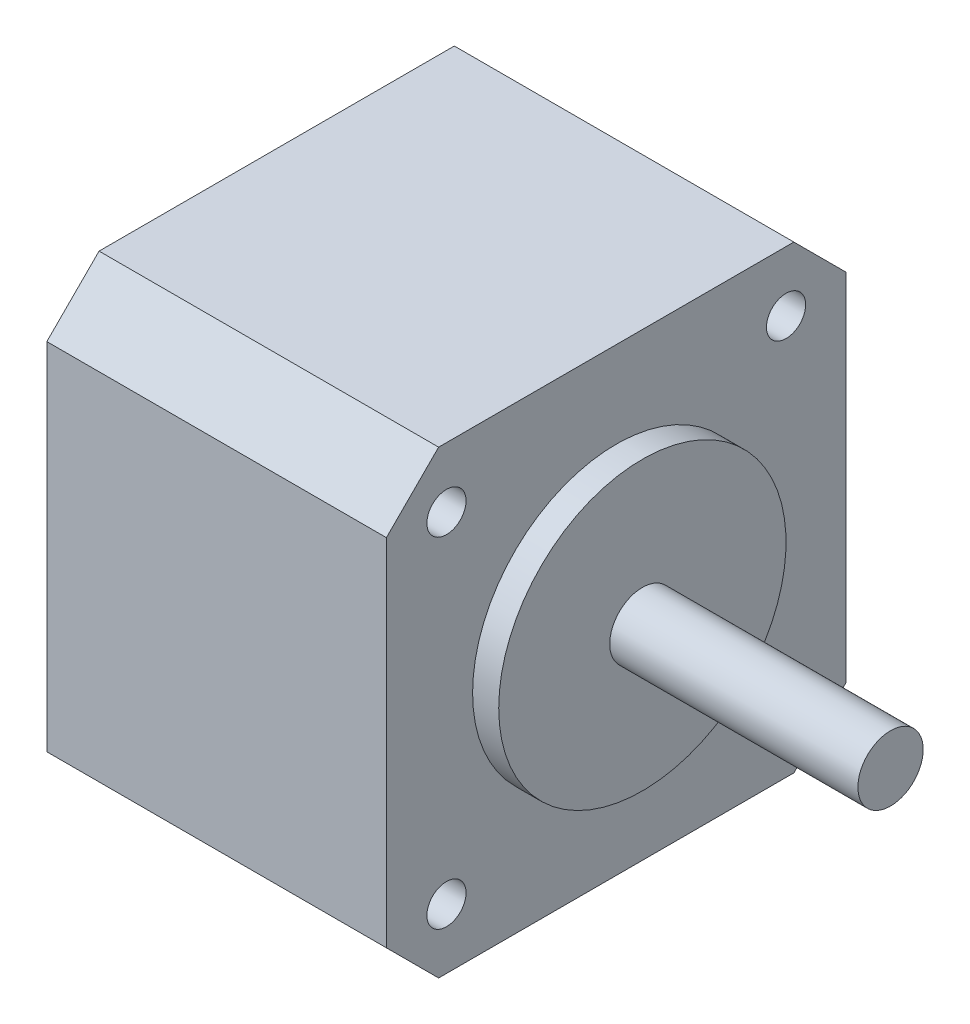
ISO-10303-21;
HEADER;
FILE_DESCRIPTION(('STEP AP214'),'2;1');
FILE_NAME('part.step','',(''),(''),'','','');
FILE_SCHEMA(('AUTOMOTIVE_DESIGN { 1 0 10303 214 1 1 1 1 }'));
ENDSEC;
DATA;
#1=APPLICATION_CONTEXT('core data for automotive mechanical design processes');
#2=APPLICATION_PROTOCOL_DEFINITION('international standard','automotive_design',2000,#1);
#3=PRODUCT_CONTEXT('',#1,'mechanical');
#4=PRODUCT('Part','Part','',(#3));
#5=PRODUCT_RELATED_PRODUCT_CATEGORY('part','',(#4));
#6=PRODUCT_DEFINITION_FORMATION('','',#4);
#7=PRODUCT_DEFINITION_CONTEXT('part definition',#1,'design');
#8=PRODUCT_DEFINITION('design','',#6,#7);
#9=PRODUCT_DEFINITION_SHAPE('','',#8);
#10=(LENGTH_UNIT() NAMED_UNIT(*) SI_UNIT(.MILLI.,.METRE.));
#11=(NAMED_UNIT(*) PLANE_ANGLE_UNIT() SI_UNIT($,.RADIAN.));
#12=(NAMED_UNIT(*) SI_UNIT($,.STERADIAN.) SOLID_ANGLE_UNIT());
#13=UNCERTAINTY_MEASURE_WITH_UNIT(LENGTH_MEASURE(1.E-05),#10,'distance_accuracy_value','');
#14=(GEOMETRIC_REPRESENTATION_CONTEXT(3) GLOBAL_UNCERTAINTY_ASSIGNED_CONTEXT((#13)) GLOBAL_UNIT_ASSIGNED_CONTEXT((#10,
#11,#12)) REPRESENTATION_CONTEXT('',''));
#15=CARTESIAN_POINT('',(0.,0.,0.));
#16=DIRECTION('',(0.,0.,1.));
#17=DIRECTION('',(1.,0.,0.));
#18=AXIS2_PLACEMENT_3D('',#15,#16,#17);
#19=CARTESIAN_POINT('',(-19.,0.,0.));
#20=DIRECTION('',(1.,0.,0.));
#21=DIRECTION('',(0.,0.,-1.));
#22=AXIS2_PLACEMENT_3D('',#19,#20,#21);
#23=CYLINDRICAL_SURFACE('',#22,2.5);
#24=CARTESIAN_POINT('',(-19.,0.,0.));
#25=DIRECTION('',(1.,0.,0.));
#26=DIRECTION('',(0.,0.,-1.));
#27=AXIS2_PLACEMENT_3D('',#24,#25,#26);
#28=CIRCLE('',#27,2.5);
#29=CARTESIAN_POINT('',(-19.,0.,-2.5));
#30=VERTEX_POINT('',#29);
#31=EDGE_CURVE('E146',#30,#30,#28,.T.);
#32=ORIENTED_EDGE('',*,*,#31,.T.);
#33=EDGE_LOOP('',(#32));
#34=FACE_BOUND('',#33,.T.);
#35=CARTESIAN_POINT('',(0.,0.,0.));
#36=DIRECTION('',(1.,0.,0.));
#37=DIRECTION('',(0.,0.,-1.));
#38=AXIS2_PLACEMENT_3D('',#35,#36,#37);
#39=CIRCLE('',#38,2.5);
#40=CARTESIAN_POINT('',(0.,0.,-2.5));
#41=VERTEX_POINT('',#40);
#42=EDGE_CURVE('E150',#41,#41,#39,.T.);
#43=ORIENTED_EDGE('',*,*,#42,.F.);
#44=EDGE_LOOP('',(#43));
#45=FACE_BOUND('',#44,.T.);
#46=ADVANCED_FACE('F42',(#34,#45),#23,.T.);
#47=CARTESIAN_POINT('',(0.,0.,0.));
#48=DIRECTION('',(1.,0.,0.));
#49=DIRECTION('',(0.,0.,-1.));
#50=AXIS2_PLACEMENT_3D('',#47,#48,#49);
#51=PLANE('',#50);
#52=ORIENTED_EDGE('',*,*,#42,.T.);
#53=EDGE_LOOP('',(#52));
#54=FACE_BOUND('',#53,.T.);
#55=ADVANCED_FACE('F230',(#54),#51,.T.);
#56=CARTESIAN_POINT('',(-21.,0.,0.));
#57=DIRECTION('',(1.,0.,0.));
#58=DIRECTION('',(0.,0.,-1.));
#59=AXIS2_PLACEMENT_3D('',#56,#57,#58);
#60=CYLINDRICAL_SURFACE('',#59,11.);
#61=CARTESIAN_POINT('',(-21.,0.,0.));
#62=DIRECTION('',(-1.,0.,0.));
#63=DIRECTION('',(0.,0.,1.));
#64=AXIS2_PLACEMENT_3D('',#61,#62,#63);
#65=CIRCLE('',#64,11.);
#66=CARTESIAN_POINT('',(-21.,0.,11.));
#67=VERTEX_POINT('',#66);
#68=EDGE_CURVE('E139',#67,#67,#65,.T.);
#69=ORIENTED_EDGE('',*,*,#68,.F.);
#70=EDGE_LOOP('',(#69));
#71=FACE_BOUND('',#70,.T.);
#72=CARTESIAN_POINT('',(-19.,0.,0.));
#73=DIRECTION('',(-1.,0.,0.));
#74=DIRECTION('',(0.,0.,1.));
#75=AXIS2_PLACEMENT_3D('',#72,#73,#74);
#76=CIRCLE('',#75,11.);
#77=CARTESIAN_POINT('',(-19.,0.,11.));
#78=VERTEX_POINT('',#77);
#79=EDGE_CURVE('E135',#78,#78,#76,.T.);
#80=ORIENTED_EDGE('',*,*,#79,.T.);
#81=EDGE_LOOP('',(#80));
#82=FACE_BOUND('',#81,.T.);
#83=ADVANCED_FACE('F236',(#71,#82),#60,.T.);
#84=CARTESIAN_POINT('',(-19.,0.,0.));
#85=DIRECTION('',(-1.,0.,0.));
#86=DIRECTION('',(0.,0.,1.));
#87=AXIS2_PLACEMENT_3D('',#84,#85,#86);
#88=PLANE('',#87);
#89=ORIENTED_EDGE('',*,*,#31,.F.);
#90=EDGE_LOOP('',(#89));
#91=FACE_BOUND('',#90,.T.);
#92=ORIENTED_EDGE('',*,*,#79,.F.);
#93=EDGE_LOOP('',(#92));
#94=FACE_BOUND('',#93,.T.);
#95=ADVANCED_FACE('F285',(#91,#94),#88,.F.);
#96=CARTESIAN_POINT('',(-21.,0.,0.));
#97=DIRECTION('',(1.,0.,0.));
#98=DIRECTION('',(0.,0.,-1.));
#99=AXIS2_PLACEMENT_3D('',#96,#97,#98);
#100=PLANE('',#99);
#101=ORIENTED_EDGE('',*,*,#68,.T.);
#102=EDGE_LOOP('',(#101));
#103=FACE_BOUND('',#102,.T.);
#104=CARTESIAN_POINT('',(-21.,-13.,13.));
#105=DIRECTION('',(-1.,0.,0.));
#106=DIRECTION('',(0.,0.,1.));
#107=AXIS2_PLACEMENT_3D('',#104,#105,#106);
#108=CIRCLE('',#107,1.5);
#109=CARTESIAN_POINT('',(-21.,-13.,14.5));
#110=VERTEX_POINT('',#109);
#111=EDGE_CURVE('E193',#110,#110,#108,.T.);
#112=ORIENTED_EDGE('',*,*,#111,.T.);
#113=EDGE_LOOP('',(#112));
#114=FACE_BOUND('',#113,.T.);
#115=CARTESIAN_POINT('',(-21.,13.,-13.));
#116=DIRECTION('',(-1.,0.,0.));
#117=DIRECTION('',(0.,0.,1.));
#118=AXIS2_PLACEMENT_3D('',#115,#116,#117);
#119=CIRCLE('',#118,1.5);
#120=CARTESIAN_POINT('',(-21.,13.,-11.5));
#121=VERTEX_POINT('',#120);
#122=EDGE_CURVE('E180',#121,#121,#119,.T.);
#123=ORIENTED_EDGE('',*,*,#122,.T.);
#124=EDGE_LOOP('',(#123));
#125=FACE_BOUND('',#124,.T.);
#126=DIRECTION('',(0.,0.,1.));
#127=VECTOR('',#126,1.);
#128=CARTESIAN_POINT('',(-21.,-17.6,-17.6));
#129=LINE('',#128,#127);
#130=CARTESIAN_POINT('',(-21.,-17.6,-13.6));
#131=VERTEX_POINT('',#130);
#132=CARTESIAN_POINT('',(-21.,-17.6,13.6));
#133=VERTEX_POINT('',#132);
#134=EDGE_CURVE('E125',#131,#133,#129,.T.);
#135=ORIENTED_EDGE('',*,*,#134,.F.);
#136=DIRECTION('',(0.,-0.707106781186549,0.707106781186546));
#137=VECTOR('',#136,1.);
#138=CARTESIAN_POINT('',(-21.,-15.6,-15.6));
#139=LINE('',#138,#137);
#140=CARTESIAN_POINT('',(-21.,-13.6,-17.6));
#141=VERTEX_POINT('',#140);
#142=EDGE_CURVE('E108',#131,#141,#139,.F.);
#143=ORIENTED_EDGE('',*,*,#142,.T.);
#144=DIRECTION('',(0.,-1.,0.));
#145=VECTOR('',#144,1.);
#146=CARTESIAN_POINT('',(-21.,-17.6,-17.6));
#147=LINE('',#146,#145);
#148=CARTESIAN_POINT('',(-21.,13.6,-17.6));
#149=VERTEX_POINT('',#148);
#150=EDGE_CURVE('E136',#149,#141,#147,.T.);
#151=ORIENTED_EDGE('',*,*,#150,.F.);
#152=DIRECTION('',(0.,-0.707106781186546,-0.707106781186549));
#153=VECTOR('',#152,1.);
#154=CARTESIAN_POINT('',(-21.,15.6,-15.6));
#155=LINE('',#154,#153);
#156=CARTESIAN_POINT('',(-21.,17.6,-13.6));
#157=VERTEX_POINT('',#156);
#158=EDGE_CURVE('E155',#149,#157,#155,.F.);
#159=ORIENTED_EDGE('',*,*,#158,.T.);
#160=DIRECTION('',(0.,0.,-1.));
#161=VECTOR('',#160,1.);
#162=CARTESIAN_POINT('',(-21.,17.6,-17.6));
#163=LINE('',#162,#161);
#164=CARTESIAN_POINT('',(-21.,17.6,13.6));
#165=VERTEX_POINT('',#164);
#166=EDGE_CURVE('E141',#165,#157,#163,.T.);
#167=ORIENTED_EDGE('',*,*,#166,.F.);
#168=DIRECTION('',(0.,0.707106781186549,-0.707106781186546));
#169=VECTOR('',#168,1.);
#170=CARTESIAN_POINT('',(-21.,15.6,15.6));
#171=LINE('',#170,#169);
#172=CARTESIAN_POINT('',(-21.,13.6,17.6));
#173=VERTEX_POINT('',#172);
#174=EDGE_CURVE('E129',#165,#173,#171,.F.);
#175=ORIENTED_EDGE('',*,*,#174,.T.);
#176=DIRECTION('',(0.,1.,0.));
#177=VECTOR('',#176,1.);
#178=CARTESIAN_POINT('',(-21.,-17.6,17.6));
#179=LINE('',#178,#177);
#180=CARTESIAN_POINT('',(-21.,-13.6,17.6));
#181=VERTEX_POINT('',#180);
#182=EDGE_CURVE('E179',#181,#173,#179,.T.);
#183=ORIENTED_EDGE('',*,*,#182,.F.);
#184=DIRECTION('',(0.,0.707106781186546,0.707106781186549));
#185=VECTOR('',#184,1.);
#186=CARTESIAN_POINT('',(-21.,-15.6,15.6));
#187=LINE('',#186,#185);
#188=EDGE_CURVE('E119',#181,#133,#187,.F.);
#189=ORIENTED_EDGE('',*,*,#188,.T.);
#190=EDGE_LOOP('',(#135,#143,#151,#159,#167,#175,#183,#189));
#191=FACE_BOUND('',#190,.T.);
#192=CARTESIAN_POINT('',(-21.,13.,13.));
#193=DIRECTION('',(-1.,0.,0.));
#194=DIRECTION('',(0.,0.,1.));
#195=AXIS2_PLACEMENT_3D('',#192,#193,#194);
#196=CIRCLE('',#195,1.5);
#197=CARTESIAN_POINT('',(-21.,13.,14.5));
#198=VERTEX_POINT('',#197);
#199=EDGE_CURVE('E185',#198,#198,#196,.T.);
#200=ORIENTED_EDGE('',*,*,#199,.T.);
#201=EDGE_LOOP('',(#200));
#202=FACE_BOUND('',#201,.T.);
#203=CARTESIAN_POINT('',(-21.,-13.,-13.));
#204=DIRECTION('',(-1.,0.,0.));
#205=DIRECTION('',(0.,0.,1.));
#206=AXIS2_PLACEMENT_3D('',#203,#204,#205);
#207=CIRCLE('',#206,1.5);
#208=CARTESIAN_POINT('',(-21.,-13.,-11.5));
#209=VERTEX_POINT('',#208);
#210=EDGE_CURVE('E189',#209,#209,#207,.T.);
#211=ORIENTED_EDGE('',*,*,#210,.T.);
#212=EDGE_LOOP('',(#211));
#213=FACE_BOUND('',#212,.T.);
#214=ADVANCED_FACE('F132',(#103,#114,#125,#191,#202,#213),#100,.T.);
#215=CARTESIAN_POINT('',(-25.,-17.6,17.6));
#216=DIRECTION('',(0.,0.,-1.));
#217=DIRECTION('',(-1.,0.,0.));
#218=AXIS2_PLACEMENT_3D('',#215,#216,#217);
#219=PLANE('',#218);
#220=DIRECTION('',(0.,1.,0.));
#221=VECTOR('',#220,1.);
#222=CARTESIAN_POINT('',(-47.,-17.6,17.6));
#223=LINE('',#222,#221);
#224=CARTESIAN_POINT('',(-47.,-13.6,17.6));
#225=VERTEX_POINT('',#224);
#226=CARTESIAN_POINT('',(-47.,13.6,17.6));
#227=VERTEX_POINT('',#226);
#228=EDGE_CURVE('E207',#225,#227,#223,.T.);
#229=ORIENTED_EDGE('',*,*,#228,.F.);
#230=DIRECTION('',(1.,0.,0.));
#231=VECTOR('',#230,1.);
#232=CARTESIAN_POINT('',(-25.,-13.6,17.6));
#233=LINE('',#232,#231);
#234=EDGE_CURVE('E170',#225,#181,#233,.T.);
#235=ORIENTED_EDGE('',*,*,#234,.T.);
#236=ORIENTED_EDGE('',*,*,#182,.T.);
#237=DIRECTION('',(-1.,0.,0.));
#238=VECTOR('',#237,1.);
#239=CARTESIAN_POINT('',(-25.,13.6,17.6));
#240=LINE('',#239,#238);
#241=EDGE_CURVE('E168',#173,#227,#240,.T.);
#242=ORIENTED_EDGE('',*,*,#241,.T.);
#243=EDGE_LOOP('',(#229,#235,#236,#242));
#244=FACE_BOUND('',#243,.T.);
#245=ADVANCED_FACE('F284',(#244),#219,.F.);
#246=CARTESIAN_POINT('',(-25.,17.6,-17.6));
#247=DIRECTION('',(0.,-1.,0.));
#248=DIRECTION('',(0.,0.,-1.));
#249=AXIS2_PLACEMENT_3D('',#246,#247,#248);
#250=PLANE('',#249);
#251=ORIENTED_EDGE('',*,*,#166,.T.);
#252=DIRECTION('',(-1.,0.,0.));
#253=VECTOR('',#252,1.);
#254=CARTESIAN_POINT('',(-25.,17.6,-13.6));
#255=LINE('',#254,#253);
#256=CARTESIAN_POINT('',(-47.,17.6,-13.6));
#257=VERTEX_POINT('',#256);
#258=EDGE_CURVE('E11',#157,#257,#255,.T.);
#259=ORIENTED_EDGE('',*,*,#258,.T.);
#260=DIRECTION('',(0.,0.,-1.));
#261=VECTOR('',#260,1.);
#262=CARTESIAN_POINT('',(-47.,17.6,17.6));
#263=LINE('',#262,#261);
#264=CARTESIAN_POINT('',(-47.,17.6,13.6));
#265=VERTEX_POINT('',#264);
#266=EDGE_CURVE('E176',#265,#257,#263,.T.);
#267=ORIENTED_EDGE('',*,*,#266,.F.);
#268=DIRECTION('',(1.,0.,0.));
#269=VECTOR('',#268,1.);
#270=CARTESIAN_POINT('',(-25.,17.6,13.6));
#271=LINE('',#270,#269);
#272=EDGE_CURVE('E51',#265,#165,#271,.T.);
#273=ORIENTED_EDGE('',*,*,#272,.T.);
#274=EDGE_LOOP('',(#251,#259,#267,#273));
#275=FACE_BOUND('',#274,.T.);
#276=ADVANCED_FACE('F175',(#275),#250,.F.);
#277=CARTESIAN_POINT('',(-25.,-17.6,-17.6));
#278=DIRECTION('',(0.,0.,1.));
#279=DIRECTION('',(1.,0.,0.));
#280=AXIS2_PLACEMENT_3D('',#277,#278,#279);
#281=PLANE('',#280);
#282=ORIENTED_EDGE('',*,*,#150,.T.);
#283=DIRECTION('',(-1.,0.,0.));
#284=VECTOR('',#283,1.);
#285=CARTESIAN_POINT('',(-25.,-13.6,-17.6));
#286=LINE('',#285,#284);
#287=CARTESIAN_POINT('',(-47.,-13.6,-17.6));
#288=VERTEX_POINT('',#287);
#289=EDGE_CURVE('E113',#141,#288,#286,.T.);
#290=ORIENTED_EDGE('',*,*,#289,.T.);
#291=DIRECTION('',(0.,-1.,0.));
#292=VECTOR('',#291,1.);
#293=CARTESIAN_POINT('',(-47.,17.6,-17.6));
#294=LINE('',#293,#292);
#295=CARTESIAN_POINT('',(-47.,13.6,-17.6));
#296=VERTEX_POINT('',#295);
#297=EDGE_CURVE('E210',#296,#288,#294,.T.);
#298=ORIENTED_EDGE('',*,*,#297,.F.);
#299=DIRECTION('',(1.,0.,0.));
#300=VECTOR('',#299,1.);
#301=CARTESIAN_POINT('',(-25.,13.6,-17.6));
#302=LINE('',#301,#300);
#303=EDGE_CURVE('E118',#296,#149,#302,.T.);
#304=ORIENTED_EDGE('',*,*,#303,.T.);
#305=EDGE_LOOP('',(#282,#290,#298,#304));
#306=FACE_BOUND('',#305,.T.);
#307=ADVANCED_FACE('F217',(#306),#281,.F.);
#308=CARTESIAN_POINT('',(-25.,-17.6,-17.6));
#309=DIRECTION('',(0.,1.,0.));
#310=DIRECTION('',(0.,0.,1.));
#311=AXIS2_PLACEMENT_3D('',#308,#309,#310);
#312=PLANE('',#311);
#313=DIRECTION('',(0.,0.,1.));
#314=VECTOR('',#313,1.);
#315=CARTESIAN_POINT('',(-47.,-17.6,-17.6));
#316=LINE('',#315,#314);
#317=CARTESIAN_POINT('',(-47.,-17.6,-13.6));
#318=VERTEX_POINT('',#317);
#319=CARTESIAN_POINT('',(-47.,-17.6,13.6));
#320=VERTEX_POINT('',#319);
#321=EDGE_CURVE('E128',#318,#320,#316,.T.);
#322=ORIENTED_EDGE('',*,*,#321,.F.);
#323=DIRECTION('',(1.,0.,0.));
#324=VECTOR('',#323,1.);
#325=CARTESIAN_POINT('',(-25.,-17.6,-13.6));
#326=LINE('',#325,#324);
#327=EDGE_CURVE('E112',#318,#131,#326,.T.);
#328=ORIENTED_EDGE('',*,*,#327,.T.);
#329=ORIENTED_EDGE('',*,*,#134,.T.);
#330=DIRECTION('',(-1.,0.,0.));
#331=VECTOR('',#330,1.);
#332=CARTESIAN_POINT('',(-25.,-17.6,13.6));
#333=LINE('',#332,#331);
#334=EDGE_CURVE('E130',#133,#320,#333,.T.);
#335=ORIENTED_EDGE('',*,*,#334,.T.);
#336=EDGE_LOOP('',(#322,#328,#329,#335));
#337=FACE_BOUND('',#336,.T.);
#338=ADVANCED_FACE('F124',(#337),#312,.F.);
#339=CARTESIAN_POINT('',(-25.,13.,-13.));
#340=DIRECTION('',(1.,0.,0.));
#341=DIRECTION('',(0.,0.,-1.));
#342=AXIS2_PLACEMENT_3D('',#339,#340,#341);
#343=CYLINDRICAL_SURFACE('',#342,1.5);
#344=CARTESIAN_POINT('',(-25.,13.,-13.));
#345=DIRECTION('',(-1.,0.,0.));
#346=DIRECTION('',(0.,0.,1.));
#347=AXIS2_PLACEMENT_3D('',#344,#345,#346);
#348=CIRCLE('',#347,1.5);
#349=CARTESIAN_POINT('',(-25.,13.,-11.5));
#350=VERTEX_POINT('',#349);
#351=EDGE_CURVE('E186',#350,#350,#348,.T.);
#352=ORIENTED_EDGE('',*,*,#351,.T.);
#353=EDGE_LOOP('',(#352));
#354=FACE_BOUND('',#353,.T.);
#355=ORIENTED_EDGE('',*,*,#122,.F.);
#356=EDGE_LOOP('',(#355));
#357=FACE_BOUND('',#356,.T.);
#358=ADVANCED_FACE('F277',(#354,#357),#343,.F.);
#359=CARTESIAN_POINT('',(-25.,13.,13.));
#360=DIRECTION('',(1.,0.,0.));
#361=DIRECTION('',(0.,0.,-1.));
#362=AXIS2_PLACEMENT_3D('',#359,#360,#361);
#363=CYLINDRICAL_SURFACE('',#362,1.5);
#364=CARTESIAN_POINT('',(-25.,13.,13.));
#365=DIRECTION('',(-1.,0.,0.));
#366=DIRECTION('',(0.,0.,1.));
#367=AXIS2_PLACEMENT_3D('',#364,#365,#366);
#368=CIRCLE('',#367,1.5);
#369=CARTESIAN_POINT('',(-25.,13.,14.5));
#370=VERTEX_POINT('',#369);
#371=EDGE_CURVE('E190',#370,#370,#368,.T.);
#372=ORIENTED_EDGE('',*,*,#371,.T.);
#373=EDGE_LOOP('',(#372));
#374=FACE_BOUND('',#373,.T.);
#375=ORIENTED_EDGE('',*,*,#199,.F.);
#376=EDGE_LOOP('',(#375));
#377=FACE_BOUND('',#376,.T.);
#378=ADVANCED_FACE('F273',(#374,#377),#363,.F.);
#379=CARTESIAN_POINT('',(-25.,-13.,13.));
#380=DIRECTION('',(1.,0.,0.));
#381=DIRECTION('',(0.,0.,-1.));
#382=AXIS2_PLACEMENT_3D('',#379,#380,#381);
#383=CYLINDRICAL_SURFACE('',#382,1.5);
#384=CARTESIAN_POINT('',(-25.,-13.,13.));
#385=DIRECTION('',(-1.,0.,0.));
#386=DIRECTION('',(0.,0.,1.));
#387=AXIS2_PLACEMENT_3D('',#384,#385,#386);
#388=CIRCLE('',#387,1.5);
#389=CARTESIAN_POINT('',(-25.,-13.,14.5));
#390=VERTEX_POINT('',#389);
#391=EDGE_CURVE('E196',#390,#390,#388,.T.);
#392=ORIENTED_EDGE('',*,*,#391,.T.);
#393=EDGE_LOOP('',(#392));
#394=FACE_BOUND('',#393,.T.);
#395=ORIENTED_EDGE('',*,*,#111,.F.);
#396=EDGE_LOOP('',(#395));
#397=FACE_BOUND('',#396,.T.);
#398=ADVANCED_FACE('F269',(#394,#397),#383,.F.);
#399=CARTESIAN_POINT('',(-25.,-13.,-13.));
#400=DIRECTION('',(1.,0.,0.));
#401=DIRECTION('',(0.,0.,-1.));
#402=AXIS2_PLACEMENT_3D('',#399,#400,#401);
#403=CYLINDRICAL_SURFACE('',#402,1.5);
#404=CARTESIAN_POINT('',(-25.,-13.,-13.));
#405=DIRECTION('',(-1.,0.,0.));
#406=DIRECTION('',(0.,0.,1.));
#407=AXIS2_PLACEMENT_3D('',#404,#405,#406);
#408=CIRCLE('',#407,1.5);
#409=CARTESIAN_POINT('',(-25.,-13.,-11.5));
#410=VERTEX_POINT('',#409);
#411=EDGE_CURVE('E201',#410,#410,#408,.T.);
#412=ORIENTED_EDGE('',*,*,#411,.T.);
#413=EDGE_LOOP('',(#412));
#414=FACE_BOUND('',#413,.T.);
#415=ORIENTED_EDGE('',*,*,#210,.F.);
#416=EDGE_LOOP('',(#415));
#417=FACE_BOUND('',#416,.T.);
#418=ADVANCED_FACE('F266',(#414,#417),#403,.F.);
#419=CARTESIAN_POINT('',(-25.,0.,0.));
#420=DIRECTION('',(-1.,0.,0.));
#421=DIRECTION('',(0.,0.,1.));
#422=AXIS2_PLACEMENT_3D('',#419,#420,#421);
#423=PLANE('',#422);
#424=ORIENTED_EDGE('',*,*,#411,.F.);
#425=EDGE_LOOP('',(#424));
#426=FACE_BOUND('',#425,.T.);
#427=ADVANCED_FACE('F264',(#426),#423,.F.);
#428=ORIENTED_EDGE('',*,*,#391,.F.);
#429=EDGE_LOOP('',(#428));
#430=FACE_BOUND('',#429,.T.);
#431=ADVANCED_FACE('F361',(#430),#423,.F.);
#432=ORIENTED_EDGE('',*,*,#371,.F.);
#433=EDGE_LOOP('',(#432));
#434=FACE_BOUND('',#433,.T.);
#435=ADVANCED_FACE('F261',(#434),#423,.F.);
#436=ORIENTED_EDGE('',*,*,#351,.F.);
#437=EDGE_LOOP('',(#436));
#438=FACE_BOUND('',#437,.T.);
#439=ADVANCED_FACE('F256',(#438),#423,.F.);
#440=CARTESIAN_POINT('',(-47.,0.,0.));
#441=DIRECTION('',(-1.,0.,0.));
#442=DIRECTION('',(0.,0.,1.));
#443=AXIS2_PLACEMENT_3D('',#440,#441,#442);
#444=PLANE('',#443);
#445=ORIENTED_EDGE('',*,*,#297,.T.);
#446=DIRECTION('',(0.,0.707106781186549,-0.707106781186546));
#447=VECTOR('',#446,1.);
#448=CARTESIAN_POINT('',(-47.,-15.6,-15.6));
#449=LINE('',#448,#447);
#450=EDGE_CURVE('E166',#288,#318,#449,.F.);
#451=ORIENTED_EDGE('',*,*,#450,.T.);
#452=ORIENTED_EDGE('',*,*,#321,.T.);
#453=DIRECTION('',(0.,-0.707106781186546,-0.707106781186549));
#454=VECTOR('',#453,1.);
#455=CARTESIAN_POINT('',(-47.,-15.6,15.6));
#456=LINE('',#455,#454);
#457=EDGE_CURVE('E164',#320,#225,#456,.F.);
#458=ORIENTED_EDGE('',*,*,#457,.T.);
#459=ORIENTED_EDGE('',*,*,#228,.T.);
#460=DIRECTION('',(0.,-0.707106781186549,0.707106781186546));
#461=VECTOR('',#460,1.);
#462=CARTESIAN_POINT('',(-47.,15.6,15.6));
#463=LINE('',#462,#461);
#464=EDGE_CURVE('E63',#227,#265,#463,.F.);
#465=ORIENTED_EDGE('',*,*,#464,.T.);
#466=ORIENTED_EDGE('',*,*,#266,.T.);
#467=DIRECTION('',(0.,0.707106781186546,0.707106781186549));
#468=VECTOR('',#467,1.);
#469=CARTESIAN_POINT('',(-47.,15.6,-15.6));
#470=LINE('',#469,#468);
#471=EDGE_CURVE('E162',#257,#296,#470,.F.);
#472=ORIENTED_EDGE('',*,*,#471,.T.);
#473=EDGE_LOOP('',(#445,#451,#452,#458,#459,#465,#466,#472));
#474=FACE_BOUND('',#473,.T.);
#475=ADVANCED_FACE('F213',(#474),#444,.T.);
#476=CARTESIAN_POINT('',(-25.,-17.6,-13.6));
#477=DIRECTION('',(0.,0.707106781186546,0.707106781186549));
#478=DIRECTION('',(1.,0.,0.));
#479=AXIS2_PLACEMENT_3D('',#476,#477,#478);
#480=PLANE('',#479);
#481=ORIENTED_EDGE('',*,*,#450,.F.);
#482=ORIENTED_EDGE('',*,*,#289,.F.);
#483=ORIENTED_EDGE('',*,*,#142,.F.);
#484=ORIENTED_EDGE('',*,*,#327,.F.);
#485=EDGE_LOOP('',(#481,#482,#483,#484));
#486=FACE_BOUND('',#485,.T.);
#487=ADVANCED_FACE('F111',(#486),#480,.F.);
#488=CARTESIAN_POINT('',(-25.,-13.6,17.6));
#489=DIRECTION('',(0.,0.707106781186549,-0.707106781186546));
#490=DIRECTION('',(1.,0.,0.));
#491=AXIS2_PLACEMENT_3D('',#488,#489,#490);
#492=PLANE('',#491);
#493=ORIENTED_EDGE('',*,*,#457,.F.);
#494=ORIENTED_EDGE('',*,*,#334,.F.);
#495=ORIENTED_EDGE('',*,*,#188,.F.);
#496=ORIENTED_EDGE('',*,*,#234,.F.);
#497=EDGE_LOOP('',(#493,#494,#495,#496));
#498=FACE_BOUND('',#497,.T.);
#499=ADVANCED_FACE('F221',(#498),#492,.F.);
#500=CARTESIAN_POINT('',(-25.,13.6,-17.6));
#501=DIRECTION('',(0.,-0.707106781186549,0.707106781186546));
#502=DIRECTION('',(1.,0.,0.));
#503=AXIS2_PLACEMENT_3D('',#500,#501,#502);
#504=PLANE('',#503);
#505=ORIENTED_EDGE('',*,*,#471,.F.);
#506=ORIENTED_EDGE('',*,*,#258,.F.);
#507=ORIENTED_EDGE('',*,*,#158,.F.);
#508=ORIENTED_EDGE('',*,*,#303,.F.);
#509=EDGE_LOOP('',(#505,#506,#507,#508));
#510=FACE_BOUND('',#509,.T.);
#511=ADVANCED_FACE('F219',(#510),#504,.F.);
#512=CARTESIAN_POINT('',(-25.,17.6,13.6));
#513=DIRECTION('',(0.,-0.707106781186546,-0.707106781186549));
#514=DIRECTION('',(1.,0.,0.));
#515=AXIS2_PLACEMENT_3D('',#512,#513,#514);
#516=PLANE('',#515);
#517=ORIENTED_EDGE('',*,*,#464,.F.);
#518=ORIENTED_EDGE('',*,*,#241,.F.);
#519=ORIENTED_EDGE('',*,*,#174,.F.);
#520=ORIENTED_EDGE('',*,*,#272,.F.);
#521=EDGE_LOOP('',(#517,#518,#519,#520));
#522=FACE_BOUND('',#521,.T.);
#523=ADVANCED_FACE('F45',(#522),#516,.F.);
#524=CLOSED_SHELL('',(#46,#55,#83,#95,#214,#245,#276,#307,#338,#358,#378,#398,#418,#427,#431,
#435,#439,#475,#487,#499,#511,#523));
#525=MANIFOLD_SOLID_BREP('B2',#524);
#526=ADVANCED_BREP_SHAPE_REPRESENTATION('',(#18,#525),#14);
#527=SHAPE_DEFINITION_REPRESENTATION(#9,#526);
ENDSEC;
END-ISO-10303-21;
